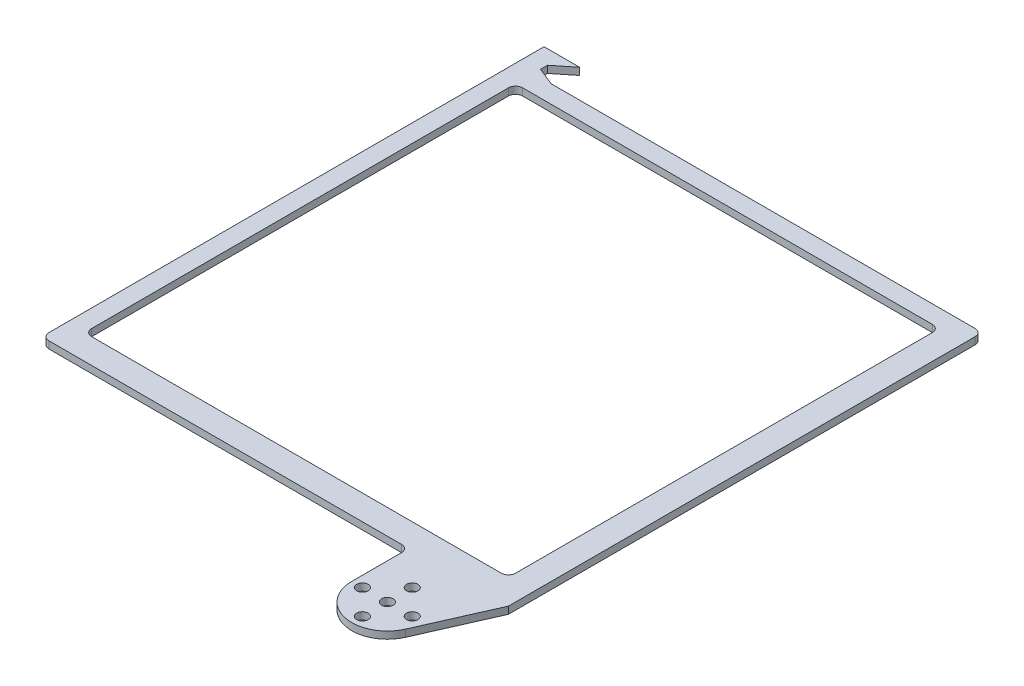
ISO-10303-21;
HEADER;
FILE_DESCRIPTION(('STEP AP214'),'2;1');
FILE_NAME('part.step','',(''),(''),'','','');
FILE_SCHEMA(('AUTOMOTIVE_DESIGN { 1 0 10303 214 1 1 1 1 }'));
ENDSEC;
DATA;
#1=APPLICATION_CONTEXT('core data for automotive mechanical design processes');
#2=APPLICATION_PROTOCOL_DEFINITION('international standard','automotive_design',2000,#1);
#3=PRODUCT_CONTEXT('',#1,'mechanical');
#4=PRODUCT('Part','Part','',(#3));
#5=PRODUCT_RELATED_PRODUCT_CATEGORY('part','',(#4));
#6=PRODUCT_DEFINITION_FORMATION('','',#4);
#7=PRODUCT_DEFINITION_CONTEXT('part definition',#1,'design');
#8=PRODUCT_DEFINITION('design','',#6,#7);
#9=PRODUCT_DEFINITION_SHAPE('','',#8);
#10=(LENGTH_UNIT() NAMED_UNIT(*) SI_UNIT(.MILLI.,.METRE.));
#11=(NAMED_UNIT(*) PLANE_ANGLE_UNIT() SI_UNIT($,.RADIAN.));
#12=(NAMED_UNIT(*) SI_UNIT($,.STERADIAN.) SOLID_ANGLE_UNIT());
#13=UNCERTAINTY_MEASURE_WITH_UNIT(LENGTH_MEASURE(1.E-05),#10,'distance_accuracy_value','');
#14=(GEOMETRIC_REPRESENTATION_CONTEXT(3) GLOBAL_UNCERTAINTY_ASSIGNED_CONTEXT((#13)) GLOBAL_UNIT_ASSIGNED_CONTEXT((#10,
#11,#12)) REPRESENTATION_CONTEXT('',''));
#15=CARTESIAN_POINT('',(0.,0.,0.));
#16=DIRECTION('',(0.,0.,1.));
#17=DIRECTION('',(1.,0.,0.));
#18=AXIS2_PLACEMENT_3D('',#15,#16,#17);
#19=CARTESIAN_POINT('',(-18.,2.,16.));
#20=DIRECTION('',(0.,1.,0.));
#21=DIRECTION('',(0.,0.,1.));
#22=AXIS2_PLACEMENT_3D('',#19,#20,#21);
#23=PLANE('',#22);
#24=CARTESIAN_POINT('',(-124.,2.,-8.99999999999998));
#25=DIRECTION('',(0.,1.,0.));
#26=DIRECTION('',(0.,0.,1.));
#27=AXIS2_PLACEMENT_3D('',#24,#25,#26);
#28=CIRCLE('',#27,1.99999999999999);
#29=CARTESIAN_POINT('',(-126.,2.,-8.99999999999998));
#30=VERTEX_POINT('',#29);
#31=CARTESIAN_POINT('',(-124.,2.,-6.99999999999999));
#32=VERTEX_POINT('',#31);
#33=EDGE_CURVE('E192',#30,#32,#28,.T.);
#34=ORIENTED_EDGE('',*,*,#33,.F.);
#35=DIRECTION('',(0.,0.,1.));
#36=VECTOR('',#35,1.);
#37=CARTESIAN_POINT('',(-126.,2.,-126.));
#38=LINE('',#37,#36);
#39=CARTESIAN_POINT('',(-126.,2.,-126.));
#40=VERTEX_POINT('',#39);
#41=EDGE_CURVE('E211',#40,#30,#38,.T.);
#42=ORIENTED_EDGE('',*,*,#41,.F.);
#43=CARTESIAN_POINT('',(-124.,2.,-126.));
#44=DIRECTION('',(0.,1.,0.));
#45=DIRECTION('',(0.,0.,1.));
#46=AXIS2_PLACEMENT_3D('',#43,#44,#45);
#47=CIRCLE('',#46,2.);
#48=CARTESIAN_POINT('',(-124.,2.,-128.));
#49=VERTEX_POINT('',#48);
#50=EDGE_CURVE('E214',#49,#40,#47,.T.);
#51=ORIENTED_EDGE('',*,*,#50,.F.);
#52=DIRECTION('',(-1.,0.,0.));
#53=VECTOR('',#52,1.);
#54=CARTESIAN_POINT('',(-124.,2.,-128.));
#55=LINE('',#54,#53);
#56=CARTESIAN_POINT('',(-9.00000000000001,2.,-128.));
#57=VERTEX_POINT('',#56);
#58=EDGE_CURVE('E242',#57,#49,#55,.T.);
#59=ORIENTED_EDGE('',*,*,#58,.F.);
#60=CARTESIAN_POINT('',(-9.00000000000001,2.,-126.));
#61=DIRECTION('',(0.,1.,0.));
#62=DIRECTION('',(0.,0.,-1.));
#63=AXIS2_PLACEMENT_3D('',#60,#61,#62);
#64=CIRCLE('',#63,2.00000000000001);
#65=CARTESIAN_POINT('',(-7.,2.,-126.));
#66=VERTEX_POINT('',#65);
#67=EDGE_CURVE('E239',#66,#57,#64,.T.);
#68=ORIENTED_EDGE('',*,*,#67,.F.);
#69=DIRECTION('',(0.,0.,-1.));
#70=VECTOR('',#69,1.);
#71=CARTESIAN_POINT('',(-7.,2.,-126.));
#72=LINE('',#71,#70);
#73=CARTESIAN_POINT('',(-6.99999999999999,2.,-8.99999999999998));
#74=VERTEX_POINT('',#73);
#75=EDGE_CURVE('E236',#74,#66,#72,.T.);
#76=ORIENTED_EDGE('',*,*,#75,.F.);
#77=CARTESIAN_POINT('',(-8.99999999999998,2.,-8.99999999999998));
#78=DIRECTION('',(0.,1.,0.));
#79=DIRECTION('',(0.,0.,1.));
#80=AXIS2_PLACEMENT_3D('',#77,#78,#79);
#81=CIRCLE('',#80,2.);
#82=CARTESIAN_POINT('',(-8.99999999999998,2.,-6.99999999999999));
#83=VERTEX_POINT('',#82);
#84=EDGE_CURVE('E233',#83,#74,#81,.T.);
#85=ORIENTED_EDGE('',*,*,#84,.F.);
#86=DIRECTION('',(1.,0.,0.));
#87=VECTOR('',#86,1.);
#88=CARTESIAN_POINT('',(-124.,2.,-6.99999999999998));
#89=LINE('',#88,#87);
#90=EDGE_CURVE('E231',#32,#83,#89,.T.);
#91=ORIENTED_EDGE('',*,*,#90,.F.);
#92=EDGE_LOOP('',(#34,#42,#51,#59,#68,#76,#85,#91));
#93=FACE_BOUND('',#92,.T.);
#94=CARTESIAN_POINT('',(-18.,2.,23.));
#95=DIRECTION('',(0.,1.,0.));
#96=DIRECTION('',(0.,0.,1.));
#97=AXIS2_PLACEMENT_3D('',#94,#95,#96);
#98=CIRCLE('',#97,1.6);
#99=CARTESIAN_POINT('',(-18.,2.,24.6));
#100=VERTEX_POINT('',#99);
#101=EDGE_CURVE('E300',#100,#100,#98,.T.);
#102=ORIENTED_EDGE('',*,*,#101,.F.);
#103=EDGE_LOOP('',(#102));
#104=FACE_BOUND('',#103,.T.);
#105=CARTESIAN_POINT('',(-18.,2.,16.));
#106=DIRECTION('',(0.,1.,0.));
#107=DIRECTION('',(0.,0.,1.));
#108=AXIS2_PLACEMENT_3D('',#105,#106,#107);
#109=CIRCLE('',#108,1.6);
#110=CARTESIAN_POINT('',(-18.,2.,17.6));
#111=VERTEX_POINT('',#110);
#112=EDGE_CURVE('E312',#111,#111,#109,.T.);
#113=ORIENTED_EDGE('',*,*,#112,.F.);
#114=EDGE_LOOP('',(#113));
#115=FACE_BOUND('',#114,.T.);
#116=DIRECTION('',(0.,0.,1.));
#117=VECTOR('',#116,1.);
#118=CARTESIAN_POINT('',(-131.,2.,0.));
#119=LINE('',#118,#117);
#120=CARTESIAN_POINT('',(-131.,2.,-141.));
#121=VERTEX_POINT('',#120);
#122=CARTESIAN_POINT('',(-131.,2.,-1.99999999999998));
#123=VERTEX_POINT('',#122);
#124=EDGE_CURVE('E332',#121,#123,#119,.T.);
#125=ORIENTED_EDGE('',*,*,#124,.T.);
#126=CARTESIAN_POINT('',(-129.,2.,-1.99999999999998));
#127=DIRECTION('',(0.,1.,0.));
#128=DIRECTION('',(0.,0.,1.));
#129=AXIS2_PLACEMENT_3D('',#126,#127,#128);
#130=CIRCLE('',#129,2.);
#131=CARTESIAN_POINT('',(-129.,2.,0.));
#132=VERTEX_POINT('',#131);
#133=EDGE_CURVE('E381',#123,#132,#130,.T.);
#134=ORIENTED_EDGE('',*,*,#133,.T.);
#135=DIRECTION('',(1.,0.,0.));
#136=VECTOR('',#135,1.);
#137=CARTESIAN_POINT('',(-28.,2.,0.));
#138=LINE('',#137,#136);
#139=CARTESIAN_POINT('',(-30.,2.,0.));
#140=VERTEX_POINT('',#139);
#141=EDGE_CURVE('E335',#132,#140,#138,.T.);
#142=ORIENTED_EDGE('',*,*,#141,.T.);
#143=CARTESIAN_POINT('',(-30.,2.,2.));
#144=DIRECTION('',(0.,1.,0.));
#145=DIRECTION('',(0.,0.,1.));
#146=AXIS2_PLACEMENT_3D('',#143,#144,#145);
#147=CIRCLE('',#146,2.);
#148=CARTESIAN_POINT('',(-28.,2.,2.));
#149=VERTEX_POINT('',#148);
#150=EDGE_CURVE('E11',#140,#149,#147,.F.);
#151=ORIENTED_EDGE('',*,*,#150,.T.);
#152=DIRECTION('',(0.,0.,1.));
#153=VECTOR('',#152,1.);
#154=CARTESIAN_POINT('',(-28.,2.,16.));
#155=LINE('',#154,#153);
#156=CARTESIAN_POINT('',(-28.,2.,16.));
#157=VERTEX_POINT('',#156);
#158=EDGE_CURVE('E338',#149,#157,#155,.T.);
#159=ORIENTED_EDGE('',*,*,#158,.T.);
#160=CARTESIAN_POINT('',(-18.,2.,16.));
#161=DIRECTION('',(0.,1.,0.));
#162=DIRECTION('',(0.,0.,1.));
#163=AXIS2_PLACEMENT_3D('',#160,#161,#162);
#164=CIRCLE('',#163,10.);
#165=CARTESIAN_POINT('',(-8.85271660683954,2.,20.0406938173055));
#166=VERTEX_POINT('',#165);
#167=EDGE_CURVE('E340',#157,#166,#164,.T.);
#168=ORIENTED_EDGE('',*,*,#167,.T.);
#169=DIRECTION('',(0.404069381730551,0.,-0.914728339316045));
#170=VECTOR('',#169,1.);
#171=CARTESIAN_POINT('',(0.,2.,0.));
#172=LINE('',#171,#170);
#173=CARTESIAN_POINT('',(0.,2.,0.));
#174=VERTEX_POINT('',#173);
#175=EDGE_CURVE('E324',#166,#174,#172,.T.);
#176=ORIENTED_EDGE('',*,*,#175,.T.);
#177=DIRECTION('',(0.,0.,-1.));
#178=VECTOR('',#177,1.);
#179=CARTESIAN_POINT('',(0.,2.,0.));
#180=LINE('',#179,#178);
#181=CARTESIAN_POINT('',(0.,2.,-131.));
#182=VERTEX_POINT('',#181);
#183=EDGE_CURVE('E327',#174,#182,#180,.T.);
#184=ORIENTED_EDGE('',*,*,#183,.T.);
#185=CARTESIAN_POINT('',(-2.,2.,-131.));
#186=DIRECTION('',(0.,1.,0.));
#187=DIRECTION('',(0.,0.,1.));
#188=AXIS2_PLACEMENT_3D('',#185,#186,#187);
#189=CIRCLE('',#188,2.);
#190=CARTESIAN_POINT('',(-2.,2.,-133.));
#191=VERTEX_POINT('',#190);
#192=EDGE_CURVE('E51',#182,#191,#189,.T.);
#193=ORIENTED_EDGE('',*,*,#192,.T.);
#194=DIRECTION('',(-1.,0.,0.));
#195=VECTOR('',#194,1.);
#196=CARTESIAN_POINT('',(0.,2.,-133.));
#197=LINE('',#196,#195);
#198=CARTESIAN_POINT('',(-121.,2.,-133.));
#199=VERTEX_POINT('',#198);
#200=EDGE_CURVE('E330',#191,#199,#197,.T.);
#201=ORIENTED_EDGE('',*,*,#200,.T.);
#202=DIRECTION('',(-0.92847669088526,0.,-0.371390676354103));
#203=VECTOR('',#202,1.);
#204=CARTESIAN_POINT('',(-126.,2.,-135.));
#205=LINE('',#204,#203);
#206=CARTESIAN_POINT('',(-126.,2.,-135.));
#207=VERTEX_POINT('',#206);
#208=EDGE_CURVE('E249',#199,#207,#205,.T.);
#209=ORIENTED_EDGE('',*,*,#208,.T.);
#210=DIRECTION('',(0.,0.,-1.));
#211=VECTOR('',#210,1.);
#212=CARTESIAN_POINT('',(-126.,2.,-137.));
#213=LINE('',#212,#211);
#214=CARTESIAN_POINT('',(-126.,2.,-137.));
#215=VERTEX_POINT('',#214);
#216=EDGE_CURVE('E271',#207,#215,#213,.T.);
#217=ORIENTED_EDGE('',*,*,#216,.T.);
#218=DIRECTION('',(0.780868809443033,0.,-0.624695047554421));
#219=VECTOR('',#218,1.);
#220=CARTESIAN_POINT('',(-121.,2.,-141.));
#221=LINE('',#220,#219);
#222=CARTESIAN_POINT('',(-121.,2.,-141.));
#223=VERTEX_POINT('',#222);
#224=EDGE_CURVE('E274',#215,#223,#221,.T.);
#225=ORIENTED_EDGE('',*,*,#224,.T.);
#226=DIRECTION('',(-1.,0.,0.));
#227=VECTOR('',#226,1.);
#228=CARTESIAN_POINT('',(-131.,2.,-141.));
#229=LINE('',#228,#227);
#230=EDGE_CURVE('E277',#223,#121,#229,.T.);
#231=ORIENTED_EDGE('',*,*,#230,.T.);
#232=EDGE_LOOP('',(#125,#134,#142,#151,#159,#168,#176,#184,#193,#201,#209,#217,#225,#231));
#233=FACE_BOUND('',#232,.T.);
#234=CARTESIAN_POINT('',(-18.,2.,9.));
#235=DIRECTION('',(0.,1.,0.));
#236=DIRECTION('',(0.,0.,1.));
#237=AXIS2_PLACEMENT_3D('',#234,#235,#236);
#238=CIRCLE('',#237,1.6);
#239=CARTESIAN_POINT('',(-18.,2.,10.6));
#240=VERTEX_POINT('',#239);
#241=EDGE_CURVE('E318',#240,#240,#238,.T.);
#242=ORIENTED_EDGE('',*,*,#241,.F.);
#243=EDGE_LOOP('',(#242));
#244=FACE_BOUND('',#243,.T.);
#245=CARTESIAN_POINT('',(-11.,2.,16.));
#246=DIRECTION('',(0.,1.,0.));
#247=DIRECTION('',(0.,0.,1.));
#248=AXIS2_PLACEMENT_3D('',#245,#246,#247);
#249=CIRCLE('',#248,1.6);
#250=CARTESIAN_POINT('',(-11.,2.,17.6));
#251=VERTEX_POINT('',#250);
#252=EDGE_CURVE('E306',#251,#251,#249,.T.);
#253=ORIENTED_EDGE('',*,*,#252,.F.);
#254=EDGE_LOOP('',(#253));
#255=FACE_BOUND('',#254,.T.);
#256=CARTESIAN_POINT('',(-25.,2.,16.));
#257=DIRECTION('',(0.,1.,0.));
#258=DIRECTION('',(0.,0.,1.));
#259=AXIS2_PLACEMENT_3D('',#256,#257,#258);
#260=CIRCLE('',#259,1.6);
#261=CARTESIAN_POINT('',(-25.,2.,17.6));
#262=VERTEX_POINT('',#261);
#263=EDGE_CURVE('E294',#262,#262,#260,.T.);
#264=ORIENTED_EDGE('',*,*,#263,.F.);
#265=EDGE_LOOP('',(#264));
#266=FACE_BOUND('',#265,.T.);
#267=ADVANCED_FACE('F36',(#93,#104,#115,#233,#244,#255,#266),#23,.T.);
#268=CARTESIAN_POINT('',(-18.,0.,16.));
#269=DIRECTION('',(0.,1.,0.));
#270=DIRECTION('',(0.,0.,1.));
#271=AXIS2_PLACEMENT_3D('',#268,#269,#270);
#272=PLANE('',#271);
#273=DIRECTION('',(0.,0.,1.));
#274=VECTOR('',#273,1.);
#275=CARTESIAN_POINT('',(-126.,0.,-126.));
#276=LINE('',#275,#274);
#277=CARTESIAN_POINT('',(-126.,0.,-126.));
#278=VERTEX_POINT('',#277);
#279=CARTESIAN_POINT('',(-126.,0.,-8.99999999999998));
#280=VERTEX_POINT('',#279);
#281=EDGE_CURVE('E197',#278,#280,#276,.T.);
#282=ORIENTED_EDGE('',*,*,#281,.T.);
#283=CARTESIAN_POINT('',(-124.,0.,-8.99999999999998));
#284=DIRECTION('',(0.,1.,0.));
#285=DIRECTION('',(0.,0.,1.));
#286=AXIS2_PLACEMENT_3D('',#283,#284,#285);
#287=CIRCLE('',#286,1.99999999999999);
#288=CARTESIAN_POINT('',(-124.,0.,-6.99999999999998));
#289=VERTEX_POINT('',#288);
#290=EDGE_CURVE('E189',#280,#289,#287,.T.);
#291=ORIENTED_EDGE('',*,*,#290,.T.);
#292=DIRECTION('',(1.,0.,0.));
#293=VECTOR('',#292,1.);
#294=CARTESIAN_POINT('',(-124.,0.,-6.99999999999998));
#295=LINE('',#294,#293);
#296=CARTESIAN_POINT('',(-8.99999999999998,0.,-6.99999999999999));
#297=VERTEX_POINT('',#296);
#298=EDGE_CURVE('E201',#289,#297,#295,.T.);
#299=ORIENTED_EDGE('',*,*,#298,.T.);
#300=CARTESIAN_POINT('',(-8.99999999999998,0.,-8.99999999999998));
#301=DIRECTION('',(0.,1.,0.));
#302=DIRECTION('',(0.,0.,1.));
#303=AXIS2_PLACEMENT_3D('',#300,#301,#302);
#304=CIRCLE('',#303,2.);
#305=CARTESIAN_POINT('',(-6.99999999999999,0.,-8.99999999999998));
#306=VERTEX_POINT('',#305);
#307=EDGE_CURVE('E205',#297,#306,#304,.T.);
#308=ORIENTED_EDGE('',*,*,#307,.T.);
#309=DIRECTION('',(0.,0.,-1.));
#310=VECTOR('',#309,1.);
#311=CARTESIAN_POINT('',(-7.,0.,-126.));
#312=LINE('',#311,#310);
#313=CARTESIAN_POINT('',(-7.,0.,-126.));
#314=VERTEX_POINT('',#313);
#315=EDGE_CURVE('E218',#306,#314,#312,.T.);
#316=ORIENTED_EDGE('',*,*,#315,.T.);
#317=CARTESIAN_POINT('',(-9.00000000000001,0.,-126.));
#318=DIRECTION('',(0.,1.,0.));
#319=DIRECTION('',(0.,0.,-1.));
#320=AXIS2_PLACEMENT_3D('',#317,#318,#319);
#321=CIRCLE('',#320,2.00000000000001);
#322=CARTESIAN_POINT('',(-9.00000000000001,0.,-128.));
#323=VERTEX_POINT('',#322);
#324=EDGE_CURVE('E221',#314,#323,#321,.T.);
#325=ORIENTED_EDGE('',*,*,#324,.T.);
#326=DIRECTION('',(-1.,0.,0.));
#327=VECTOR('',#326,1.);
#328=CARTESIAN_POINT('',(-124.,0.,-128.));
#329=LINE('',#328,#327);
#330=CARTESIAN_POINT('',(-124.,0.,-128.));
#331=VERTEX_POINT('',#330);
#332=EDGE_CURVE('E224',#323,#331,#329,.T.);
#333=ORIENTED_EDGE('',*,*,#332,.T.);
#334=CARTESIAN_POINT('',(-124.,0.,-126.));
#335=DIRECTION('',(0.,1.,0.));
#336=DIRECTION('',(0.,0.,1.));
#337=AXIS2_PLACEMENT_3D('',#334,#335,#336);
#338=CIRCLE('',#337,2.);
#339=EDGE_CURVE('E227',#331,#278,#338,.T.);
#340=ORIENTED_EDGE('',*,*,#339,.T.);
#341=EDGE_LOOP('',(#282,#291,#299,#308,#316,#325,#333,#340));
#342=FACE_BOUND('',#341,.T.);
#343=DIRECTION('',(1.,0.,0.));
#344=VECTOR('',#343,1.);
#345=CARTESIAN_POINT('',(-28.,0.,0.));
#346=LINE('',#345,#344);
#347=CARTESIAN_POINT('',(-129.,0.,0.));
#348=VERTEX_POINT('',#347);
#349=CARTESIAN_POINT('',(-30.,0.,0.));
#350=VERTEX_POINT('',#349);
#351=EDGE_CURVE('E352',#348,#350,#346,.T.);
#352=ORIENTED_EDGE('',*,*,#351,.F.);
#353=CARTESIAN_POINT('',(-129.,0.,-1.99999999999998));
#354=DIRECTION('',(0.,1.,0.));
#355=DIRECTION('',(0.,0.,1.));
#356=AXIS2_PLACEMENT_3D('',#353,#354,#355);
#357=CIRCLE('',#356,2.);
#358=CARTESIAN_POINT('',(-131.,0.,-1.99999999999998));
#359=VERTEX_POINT('',#358);
#360=EDGE_CURVE('E376',#348,#359,#357,.F.);
#361=ORIENTED_EDGE('',*,*,#360,.T.);
#362=DIRECTION('',(0.,0.,1.));
#363=VECTOR('',#362,1.);
#364=CARTESIAN_POINT('',(-131.,0.,0.));
#365=LINE('',#364,#363);
#366=CARTESIAN_POINT('',(-131.,0.,-141.));
#367=VERTEX_POINT('',#366);
#368=EDGE_CURVE('E349',#367,#359,#365,.T.);
#369=ORIENTED_EDGE('',*,*,#368,.F.);
#370=DIRECTION('',(1.,0.,0.));
#371=VECTOR('',#370,1.);
#372=CARTESIAN_POINT('',(-131.,0.,-141.));
#373=LINE('',#372,#371);
#374=CARTESIAN_POINT('',(-121.,0.,-141.));
#375=VERTEX_POINT('',#374);
#376=EDGE_CURVE('E266',#367,#375,#373,.T.);
#377=ORIENTED_EDGE('',*,*,#376,.T.);
#378=DIRECTION('',(-0.780868809443033,0.,0.624695047554421));
#379=VECTOR('',#378,1.);
#380=CARTESIAN_POINT('',(-121.,0.,-141.));
#381=LINE('',#380,#379);
#382=CARTESIAN_POINT('',(-126.,0.,-137.));
#383=VERTEX_POINT('',#382);
#384=EDGE_CURVE('E263',#375,#383,#381,.T.);
#385=ORIENTED_EDGE('',*,*,#384,.T.);
#386=DIRECTION('',(0.,0.,1.));
#387=VECTOR('',#386,1.);
#388=CARTESIAN_POINT('',(-126.,0.,-137.));
#389=LINE('',#388,#387);
#390=CARTESIAN_POINT('',(-126.,0.,-135.));
#391=VERTEX_POINT('',#390);
#392=EDGE_CURVE('E261',#383,#391,#389,.T.);
#393=ORIENTED_EDGE('',*,*,#392,.T.);
#394=DIRECTION('',(0.92847669088526,0.,0.371390676354103));
#395=VECTOR('',#394,1.);
#396=CARTESIAN_POINT('',(-126.,0.,-135.));
#397=LINE('',#396,#395);
#398=CARTESIAN_POINT('',(-121.,0.,-133.));
#399=VERTEX_POINT('',#398);
#400=EDGE_CURVE('E268',#391,#399,#397,.T.);
#401=ORIENTED_EDGE('',*,*,#400,.T.);
#402=DIRECTION('',(-1.,0.,0.));
#403=VECTOR('',#402,1.);
#404=CARTESIAN_POINT('',(0.,0.,-133.));
#405=LINE('',#404,#403);
#406=CARTESIAN_POINT('',(-2.,0.,-133.));
#407=VERTEX_POINT('',#406);
#408=EDGE_CURVE('E347',#407,#399,#405,.T.);
#409=ORIENTED_EDGE('',*,*,#408,.F.);
#410=CARTESIAN_POINT('',(-2.,0.,-131.));
#411=DIRECTION('',(0.,1.,0.));
#412=DIRECTION('',(0.,0.,1.));
#413=AXIS2_PLACEMENT_3D('',#410,#411,#412);
#414=CIRCLE('',#413,2.);
#415=CARTESIAN_POINT('',(0.,0.,-131.));
#416=VERTEX_POINT('',#415);
#417=EDGE_CURVE('E374',#407,#416,#414,.F.);
#418=ORIENTED_EDGE('',*,*,#417,.T.);
#419=DIRECTION('',(0.,0.,-1.));
#420=VECTOR('',#419,1.);
#421=CARTESIAN_POINT('',(0.,0.,0.));
#422=LINE('',#421,#420);
#423=CARTESIAN_POINT('',(0.,0.,0.));
#424=VERTEX_POINT('',#423);
#425=EDGE_CURVE('E345',#424,#416,#422,.T.);
#426=ORIENTED_EDGE('',*,*,#425,.F.);
#427=DIRECTION('',(0.404069381730551,0.,-0.914728339316045));
#428=VECTOR('',#427,1.);
#429=CARTESIAN_POINT('',(0.,0.,0.));
#430=LINE('',#429,#428);
#431=CARTESIAN_POINT('',(-8.85271660683954,0.,20.0406938173055));
#432=VERTEX_POINT('',#431);
#433=EDGE_CURVE('E321',#432,#424,#430,.T.);
#434=ORIENTED_EDGE('',*,*,#433,.F.);
#435=CARTESIAN_POINT('',(-18.,0.,16.));
#436=DIRECTION('',(0.,1.,0.));
#437=DIRECTION('',(0.,0.,1.));
#438=AXIS2_PLACEMENT_3D('',#435,#436,#437);
#439=CIRCLE('',#438,10.);
#440=CARTESIAN_POINT('',(-28.,0.,16.));
#441=VERTEX_POINT('',#440);
#442=EDGE_CURVE('E328',#441,#432,#439,.T.);
#443=ORIENTED_EDGE('',*,*,#442,.F.);
#444=DIRECTION('',(0.,0.,1.));
#445=VECTOR('',#444,1.);
#446=CARTESIAN_POINT('',(-28.,0.,16.));
#447=LINE('',#446,#445);
#448=CARTESIAN_POINT('',(-28.,0.,2.));
#449=VERTEX_POINT('',#448);
#450=EDGE_CURVE('E355',#449,#441,#447,.T.);
#451=ORIENTED_EDGE('',*,*,#450,.F.);
#452=CARTESIAN_POINT('',(-30.,0.,2.));
#453=DIRECTION('',(0.,1.,0.));
#454=DIRECTION('',(0.,0.,1.));
#455=AXIS2_PLACEMENT_3D('',#452,#453,#454);
#456=CIRCLE('',#455,2.);
#457=EDGE_CURVE('E44',#449,#350,#456,.T.);
#458=ORIENTED_EDGE('',*,*,#457,.T.);
#459=EDGE_LOOP('',(#352,#361,#369,#377,#385,#393,#401,#409,#418,#426,#434,#443,#451,#458));
#460=FACE_BOUND('',#459,.T.);
#461=CARTESIAN_POINT('',(-18.,0.,9.));
#462=DIRECTION('',(0.,1.,0.));
#463=DIRECTION('',(0.,0.,1.));
#464=AXIS2_PLACEMENT_3D('',#461,#462,#463);
#465=CIRCLE('',#464,1.6);
#466=CARTESIAN_POINT('',(-18.,0.,10.6));
#467=VERTEX_POINT('',#466);
#468=EDGE_CURVE('E315',#467,#467,#465,.T.);
#469=ORIENTED_EDGE('',*,*,#468,.T.);
#470=EDGE_LOOP('',(#469));
#471=FACE_BOUND('',#470,.T.);
#472=CARTESIAN_POINT('',(-18.,0.,16.));
#473=DIRECTION('',(0.,1.,0.));
#474=DIRECTION('',(0.,0.,1.));
#475=AXIS2_PLACEMENT_3D('',#472,#473,#474);
#476=CIRCLE('',#475,1.6);
#477=CARTESIAN_POINT('',(-18.,0.,17.6));
#478=VERTEX_POINT('',#477);
#479=EDGE_CURVE('E309',#478,#478,#476,.T.);
#480=ORIENTED_EDGE('',*,*,#479,.T.);
#481=EDGE_LOOP('',(#480));
#482=FACE_BOUND('',#481,.T.);
#483=CARTESIAN_POINT('',(-11.,0.,16.));
#484=DIRECTION('',(0.,1.,0.));
#485=DIRECTION('',(0.,0.,1.));
#486=AXIS2_PLACEMENT_3D('',#483,#484,#485);
#487=CIRCLE('',#486,1.6);
#488=CARTESIAN_POINT('',(-11.,0.,17.6));
#489=VERTEX_POINT('',#488);
#490=EDGE_CURVE('E303',#489,#489,#487,.T.);
#491=ORIENTED_EDGE('',*,*,#490,.T.);
#492=EDGE_LOOP('',(#491));
#493=FACE_BOUND('',#492,.T.);
#494=CARTESIAN_POINT('',(-18.,0.,23.));
#495=DIRECTION('',(0.,1.,0.));
#496=DIRECTION('',(0.,0.,1.));
#497=AXIS2_PLACEMENT_3D('',#494,#495,#496);
#498=CIRCLE('',#497,1.6);
#499=CARTESIAN_POINT('',(-18.,0.,24.6));
#500=VERTEX_POINT('',#499);
#501=EDGE_CURVE('E297',#500,#500,#498,.T.);
#502=ORIENTED_EDGE('',*,*,#501,.T.);
#503=EDGE_LOOP('',(#502));
#504=FACE_BOUND('',#503,.T.);
#505=CARTESIAN_POINT('',(-25.,0.,16.));
#506=DIRECTION('',(0.,1.,0.));
#507=DIRECTION('',(0.,0.,1.));
#508=AXIS2_PLACEMENT_3D('',#505,#506,#507);
#509=CIRCLE('',#508,1.6);
#510=CARTESIAN_POINT('',(-25.,0.,17.6));
#511=VERTEX_POINT('',#510);
#512=EDGE_CURVE('E293',#511,#511,#509,.T.);
#513=ORIENTED_EDGE('',*,*,#512,.T.);
#514=EDGE_LOOP('',(#513));
#515=FACE_BOUND('',#514,.T.);
#516=ADVANCED_FACE('F207',(#342,#460,#471,#482,#493,#504,#515),#272,.F.);
#517=CARTESIAN_POINT('',(0.,2.,0.));
#518=DIRECTION('',(-0.914728339316045,0.,-0.404069381730551));
#519=DIRECTION('',(-0.404069381730551,0.,0.914728339316045));
#520=AXIS2_PLACEMENT_3D('',#517,#518,#519);
#521=PLANE('',#520);
#522=ORIENTED_EDGE('',*,*,#433,.T.);
#523=DIRECTION('',(0.,-1.,0.));
#524=VECTOR('',#523,1.);
#525=CARTESIAN_POINT('',(0.,2.,0.));
#526=LINE('',#525,#524);
#527=EDGE_CURVE('E363',#174,#424,#526,.T.);
#528=ORIENTED_EDGE('',*,*,#527,.F.);
#529=ORIENTED_EDGE('',*,*,#175,.F.);
#530=DIRECTION('',(0.,-1.,0.));
#531=VECTOR('',#530,1.);
#532=CARTESIAN_POINT('',(-8.85271660683954,2.,20.0406938173055));
#533=LINE('',#532,#531);
#534=EDGE_CURVE('E342',#166,#432,#533,.T.);
#535=ORIENTED_EDGE('',*,*,#534,.T.);
#536=EDGE_LOOP('',(#522,#528,#529,#535));
#537=FACE_BOUND('',#536,.T.);
#538=ADVANCED_FACE('F411',(#537),#521,.F.);
#539=CARTESIAN_POINT('',(0.,2.,0.));
#540=DIRECTION('',(-1.,0.,0.));
#541=DIRECTION('',(0.,0.,1.));
#542=AXIS2_PLACEMENT_3D('',#539,#540,#541);
#543=PLANE('',#542);
#544=ORIENTED_EDGE('',*,*,#425,.T.);
#545=DIRECTION('',(0.,-1.,0.));
#546=VECTOR('',#545,1.);
#547=CARTESIAN_POINT('',(0.,2.,-131.));
#548=LINE('',#547,#546);
#549=EDGE_CURVE('E59',#416,#182,#548,.F.);
#550=ORIENTED_EDGE('',*,*,#549,.T.);
#551=ORIENTED_EDGE('',*,*,#183,.F.);
#552=ORIENTED_EDGE('',*,*,#527,.T.);
#553=EDGE_LOOP('',(#544,#550,#551,#552));
#554=FACE_BOUND('',#553,.T.);
#555=ADVANCED_FACE('F413',(#554),#543,.F.);
#556=CARTESIAN_POINT('',(0.,2.,-133.));
#557=DIRECTION('',(0.,0.,1.));
#558=DIRECTION('',(1.,0.,0.));
#559=AXIS2_PLACEMENT_3D('',#556,#557,#558);
#560=PLANE('',#559);
#561=ORIENTED_EDGE('',*,*,#200,.F.);
#562=DIRECTION('',(0.,-1.,0.));
#563=VECTOR('',#562,1.);
#564=CARTESIAN_POINT('',(-2.,2.,-133.));
#565=LINE('',#564,#563);
#566=EDGE_CURVE('E383',#191,#407,#565,.T.);
#567=ORIENTED_EDGE('',*,*,#566,.T.);
#568=ORIENTED_EDGE('',*,*,#408,.T.);
#569=DIRECTION('',(0.,1.,0.));
#570=VECTOR('',#569,1.);
#571=CARTESIAN_POINT('',(-121.,-12.8062484748657,-133.));
#572=LINE('',#571,#570);
#573=EDGE_CURVE('E280',#399,#199,#572,.T.);
#574=ORIENTED_EDGE('',*,*,#573,.T.);
#575=EDGE_LOOP('',(#561,#567,#568,#574));
#576=FACE_BOUND('',#575,.T.);
#577=ADVANCED_FACE('F418',(#576),#560,.F.);
#578=CARTESIAN_POINT('',(-131.,2.,0.));
#579=DIRECTION('',(1.,0.,0.));
#580=DIRECTION('',(0.,0.,-1.));
#581=AXIS2_PLACEMENT_3D('',#578,#579,#580);
#582=PLANE('',#581);
#583=ORIENTED_EDGE('',*,*,#368,.T.);
#584=DIRECTION('',(0.,-1.,0.));
#585=VECTOR('',#584,1.);
#586=CARTESIAN_POINT('',(-131.,2.,-1.99999999999998));
#587=LINE('',#586,#585);
#588=EDGE_CURVE('E378',#359,#123,#587,.F.);
#589=ORIENTED_EDGE('',*,*,#588,.T.);
#590=ORIENTED_EDGE('',*,*,#124,.F.);
#591=DIRECTION('',(0.,1.,0.));
#592=VECTOR('',#591,1.);
#593=CARTESIAN_POINT('',(-131.,-12.8062484748657,-141.));
#594=LINE('',#593,#592);
#595=EDGE_CURVE('E264',#367,#121,#594,.T.);
#596=ORIENTED_EDGE('',*,*,#595,.F.);
#597=EDGE_LOOP('',(#583,#589,#590,#596));
#598=FACE_BOUND('',#597,.T.);
#599=ADVANCED_FACE('F445',(#598),#582,.F.);
#600=CARTESIAN_POINT('',(-28.,2.,0.));
#601=DIRECTION('',(0.,0.,-1.));
#602=DIRECTION('',(-1.,0.,0.));
#603=AXIS2_PLACEMENT_3D('',#600,#601,#602);
#604=PLANE('',#603);
#605=ORIENTED_EDGE('',*,*,#351,.T.);
#606=DIRECTION('',(0.,-1.,0.));
#607=VECTOR('',#606,1.);
#608=CARTESIAN_POINT('',(-30.,2.,0.));
#609=LINE('',#608,#607);
#610=EDGE_CURVE('E372',#350,#140,#609,.F.);
#611=ORIENTED_EDGE('',*,*,#610,.T.);
#612=ORIENTED_EDGE('',*,*,#141,.F.);
#613=DIRECTION('',(0.,-1.,0.));
#614=VECTOR('',#613,1.);
#615=CARTESIAN_POINT('',(-129.,2.,0.));
#616=LINE('',#615,#614);
#617=EDGE_CURVE('E369',#132,#348,#616,.T.);
#618=ORIENTED_EDGE('',*,*,#617,.T.);
#619=EDGE_LOOP('',(#605,#611,#612,#618));
#620=FACE_BOUND('',#619,.T.);
#621=ADVANCED_FACE('F394',(#620),#604,.F.);
#622=CARTESIAN_POINT('',(-28.,2.,16.));
#623=DIRECTION('',(1.,0.,0.));
#624=DIRECTION('',(0.,0.,-1.));
#625=AXIS2_PLACEMENT_3D('',#622,#623,#624);
#626=PLANE('',#625);
#627=ORIENTED_EDGE('',*,*,#158,.F.);
#628=DIRECTION('',(0.,-1.,0.));
#629=VECTOR('',#628,1.);
#630=CARTESIAN_POINT('',(-28.,0.,2.));
#631=LINE('',#630,#629);
#632=EDGE_CURVE('E366',#149,#449,#631,.T.);
#633=ORIENTED_EDGE('',*,*,#632,.T.);
#634=ORIENTED_EDGE('',*,*,#450,.T.);
#635=DIRECTION('',(0.,-1.,0.));
#636=VECTOR('',#635,1.);
#637=CARTESIAN_POINT('',(-28.,2.,16.));
#638=LINE('',#637,#636);
#639=EDGE_CURVE('E360',#157,#441,#638,.T.);
#640=ORIENTED_EDGE('',*,*,#639,.F.);
#641=EDGE_LOOP('',(#627,#633,#634,#640));
#642=FACE_BOUND('',#641,.T.);
#643=ADVANCED_FACE('F403',(#642),#626,.F.);
#644=CARTESIAN_POINT('',(-18.,2.,16.));
#645=DIRECTION('',(0.,-1.,0.));
#646=DIRECTION('',(0.,0.,-1.));
#647=AXIS2_PLACEMENT_3D('',#644,#645,#646);
#648=CYLINDRICAL_SURFACE('',#647,10.);
#649=ORIENTED_EDGE('',*,*,#442,.T.);
#650=ORIENTED_EDGE('',*,*,#534,.F.);
#651=ORIENTED_EDGE('',*,*,#167,.F.);
#652=ORIENTED_EDGE('',*,*,#639,.T.);
#653=EDGE_LOOP('',(#649,#650,#651,#652));
#654=FACE_BOUND('',#653,.T.);
#655=ADVANCED_FACE('F407',(#654),#648,.T.);
#656=CARTESIAN_POINT('',(-18.,2.,9.));
#657=DIRECTION('',(0.,-1.,0.));
#658=DIRECTION('',(0.,0.,-1.));
#659=AXIS2_PLACEMENT_3D('',#656,#657,#658);
#660=CYLINDRICAL_SURFACE('',#659,1.6);
#661=ORIENTED_EDGE('',*,*,#241,.T.);
#662=EDGE_LOOP('',(#661));
#663=FACE_BOUND('',#662,.T.);
#664=ORIENTED_EDGE('',*,*,#468,.F.);
#665=EDGE_LOOP('',(#664));
#666=FACE_BOUND('',#665,.T.);
#667=ADVANCED_FACE('F463',(#663,#666),#660,.F.);
#668=CARTESIAN_POINT('',(-18.,2.,16.));
#669=DIRECTION('',(0.,-1.,0.));
#670=DIRECTION('',(0.,0.,-1.));
#671=AXIS2_PLACEMENT_3D('',#668,#669,#670);
#672=CYLINDRICAL_SURFACE('',#671,1.6);
#673=ORIENTED_EDGE('',*,*,#112,.T.);
#674=EDGE_LOOP('',(#673));
#675=FACE_BOUND('',#674,.T.);
#676=ORIENTED_EDGE('',*,*,#479,.F.);
#677=EDGE_LOOP('',(#676));
#678=FACE_BOUND('',#677,.T.);
#679=ADVANCED_FACE('F485',(#675,#678),#672,.F.);
#680=CARTESIAN_POINT('',(-11.,2.,16.));
#681=DIRECTION('',(0.,-1.,0.));
#682=DIRECTION('',(0.,0.,-1.));
#683=AXIS2_PLACEMENT_3D('',#680,#681,#682);
#684=CYLINDRICAL_SURFACE('',#683,1.6);
#685=ORIENTED_EDGE('',*,*,#252,.T.);
#686=EDGE_LOOP('',(#685));
#687=FACE_BOUND('',#686,.T.);
#688=ORIENTED_EDGE('',*,*,#490,.F.);
#689=EDGE_LOOP('',(#688));
#690=FACE_BOUND('',#689,.T.);
#691=ADVANCED_FACE('F492',(#687,#690),#684,.F.);
#692=CARTESIAN_POINT('',(-18.,2.,23.));
#693=DIRECTION('',(0.,-1.,0.));
#694=DIRECTION('',(0.,0.,-1.));
#695=AXIS2_PLACEMENT_3D('',#692,#693,#694);
#696=CYLINDRICAL_SURFACE('',#695,1.6);
#697=ORIENTED_EDGE('',*,*,#101,.T.);
#698=EDGE_LOOP('',(#697));
#699=FACE_BOUND('',#698,.T.);
#700=ORIENTED_EDGE('',*,*,#501,.F.);
#701=EDGE_LOOP('',(#700));
#702=FACE_BOUND('',#701,.T.);
#703=ADVANCED_FACE('F499',(#699,#702),#696,.F.);
#704=CARTESIAN_POINT('',(-25.,2.,16.));
#705=DIRECTION('',(0.,-1.,0.));
#706=DIRECTION('',(0.,0.,-1.));
#707=AXIS2_PLACEMENT_3D('',#704,#705,#706);
#708=CYLINDRICAL_SURFACE('',#707,1.6);
#709=ORIENTED_EDGE('',*,*,#263,.T.);
#710=EDGE_LOOP('',(#709));
#711=FACE_BOUND('',#710,.T.);
#712=ORIENTED_EDGE('',*,*,#512,.F.);
#713=EDGE_LOOP('',(#712));
#714=FACE_BOUND('',#713,.T.);
#715=ADVANCED_FACE('F507',(#711,#714),#708,.F.);
#716=CARTESIAN_POINT('',(-131.,-12.8062484748657,-141.));
#717=DIRECTION('',(0.,0.,-1.));
#718=DIRECTION('',(-1.,0.,0.));
#719=AXIS2_PLACEMENT_3D('',#716,#717,#718);
#720=PLANE('',#719);
#721=ORIENTED_EDGE('',*,*,#376,.F.);
#722=ORIENTED_EDGE('',*,*,#595,.T.);
#723=ORIENTED_EDGE('',*,*,#230,.F.);
#724=DIRECTION('',(0.,1.,0.));
#725=VECTOR('',#724,1.);
#726=CARTESIAN_POINT('',(-121.,-12.8062484748657,-141.));
#727=LINE('',#726,#725);
#728=EDGE_CURVE('E283',#375,#223,#727,.T.);
#729=ORIENTED_EDGE('',*,*,#728,.F.);
#730=EDGE_LOOP('',(#721,#722,#723,#729));
#731=FACE_BOUND('',#730,.T.);
#732=ADVANCED_FACE('F438',(#731),#720,.T.);
#733=CARTESIAN_POINT('',(-121.,-12.8062484748657,-141.));
#734=DIRECTION('',(0.624695047554421,0.,0.780868809443033));
#735=DIRECTION('',(0.780868809443033,0.,-0.624695047554421));
#736=AXIS2_PLACEMENT_3D('',#733,#734,#735);
#737=PLANE('',#736);
#738=ORIENTED_EDGE('',*,*,#384,.F.);
#739=ORIENTED_EDGE('',*,*,#728,.T.);
#740=ORIENTED_EDGE('',*,*,#224,.F.);
#741=DIRECTION('',(0.,1.,0.));
#742=VECTOR('',#741,1.);
#743=CARTESIAN_POINT('',(-126.,-12.8062484748657,-137.));
#744=LINE('',#743,#742);
#745=EDGE_CURVE('E285',#383,#215,#744,.T.);
#746=ORIENTED_EDGE('',*,*,#745,.F.);
#747=EDGE_LOOP('',(#738,#739,#740,#746));
#748=FACE_BOUND('',#747,.T.);
#749=ADVANCED_FACE('F433',(#748),#737,.T.);
#750=CARTESIAN_POINT('',(-126.,-12.8062484748657,-137.));
#751=DIRECTION('',(1.,0.,0.));
#752=DIRECTION('',(0.,0.,-1.));
#753=AXIS2_PLACEMENT_3D('',#750,#751,#752);
#754=PLANE('',#753);
#755=ORIENTED_EDGE('',*,*,#392,.F.);
#756=ORIENTED_EDGE('',*,*,#745,.T.);
#757=ORIENTED_EDGE('',*,*,#216,.F.);
#758=DIRECTION('',(0.,1.,0.));
#759=VECTOR('',#758,1.);
#760=CARTESIAN_POINT('',(-126.,-12.8062484748657,-135.));
#761=LINE('',#760,#759);
#762=EDGE_CURVE('E287',#391,#207,#761,.T.);
#763=ORIENTED_EDGE('',*,*,#762,.F.);
#764=EDGE_LOOP('',(#755,#756,#757,#763));
#765=FACE_BOUND('',#764,.T.);
#766=ADVANCED_FACE('F429',(#765),#754,.T.);
#767=CARTESIAN_POINT('',(-126.,-12.8062484748657,-135.));
#768=DIRECTION('',(0.371390676354103,0.,-0.92847669088526));
#769=DIRECTION('',(-0.92847669088526,0.,-0.371390676354103));
#770=AXIS2_PLACEMENT_3D('',#767,#768,#769);
#771=PLANE('',#770);
#772=ORIENTED_EDGE('',*,*,#400,.F.);
#773=ORIENTED_EDGE('',*,*,#762,.T.);
#774=ORIENTED_EDGE('',*,*,#208,.F.);
#775=ORIENTED_EDGE('',*,*,#573,.F.);
#776=EDGE_LOOP('',(#772,#773,#774,#775));
#777=FACE_BOUND('',#776,.T.);
#778=ADVANCED_FACE('F425',(#777),#771,.T.);
#779=CARTESIAN_POINT('',(-124.,0.,-8.99999999999998));
#780=DIRECTION('',(0.,1.,0.));
#781=DIRECTION('',(0.,0.,1.));
#782=AXIS2_PLACEMENT_3D('',#779,#780,#781);
#783=CYLINDRICAL_SURFACE('',#782,1.99999999999999);
#784=ORIENTED_EDGE('',*,*,#33,.T.);
#785=DIRECTION('',(0.,1.,0.));
#786=VECTOR('',#785,1.);
#787=CARTESIAN_POINT('',(-124.,0.,-6.99999999999998));
#788=LINE('',#787,#786);
#789=EDGE_CURVE('E185',#289,#32,#788,.T.);
#790=ORIENTED_EDGE('',*,*,#789,.F.);
#791=ORIENTED_EDGE('',*,*,#290,.F.);
#792=DIRECTION('',(0.,1.,0.));
#793=VECTOR('',#792,1.);
#794=CARTESIAN_POINT('',(-126.,0.,-8.99999999999998));
#795=LINE('',#794,#793);
#796=EDGE_CURVE('E247',#280,#30,#795,.T.);
#797=ORIENTED_EDGE('',*,*,#796,.T.);
#798=EDGE_LOOP('',(#784,#790,#791,#797));
#799=FACE_BOUND('',#798,.T.);
#800=ADVANCED_FACE('F187',(#799),#783,.F.);
#801=CARTESIAN_POINT('',(-126.,0.,-126.));
#802=DIRECTION('',(-1.,0.,0.));
#803=DIRECTION('',(0.,0.,1.));
#804=AXIS2_PLACEMENT_3D('',#801,#802,#803);
#805=PLANE('',#804);
#806=ORIENTED_EDGE('',*,*,#41,.T.);
#807=ORIENTED_EDGE('',*,*,#796,.F.);
#808=ORIENTED_EDGE('',*,*,#281,.F.);
#809=DIRECTION('',(0.,1.,0.));
#810=VECTOR('',#809,1.);
#811=CARTESIAN_POINT('',(-126.,0.,-126.));
#812=LINE('',#811,#810);
#813=EDGE_CURVE('E250',#278,#40,#812,.T.);
#814=ORIENTED_EDGE('',*,*,#813,.T.);
#815=EDGE_LOOP('',(#806,#807,#808,#814));
#816=FACE_BOUND('',#815,.T.);
#817=ADVANCED_FACE('F546',(#816),#805,.F.);
#818=CARTESIAN_POINT('',(-124.,0.,-126.));
#819=DIRECTION('',(0.,1.,0.));
#820=DIRECTION('',(0.,0.,1.));
#821=AXIS2_PLACEMENT_3D('',#818,#819,#820);
#822=CYLINDRICAL_SURFACE('',#821,2.);
#823=ORIENTED_EDGE('',*,*,#50,.T.);
#824=ORIENTED_EDGE('',*,*,#813,.F.);
#825=ORIENTED_EDGE('',*,*,#339,.F.);
#826=DIRECTION('',(0.,1.,0.));
#827=VECTOR('',#826,1.);
#828=CARTESIAN_POINT('',(-124.,0.,-128.));
#829=LINE('',#828,#827);
#830=EDGE_CURVE('E252',#331,#49,#829,.T.);
#831=ORIENTED_EDGE('',*,*,#830,.T.);
#832=EDGE_LOOP('',(#823,#824,#825,#831));
#833=FACE_BOUND('',#832,.T.);
#834=ADVANCED_FACE('F553',(#833),#822,.F.);
#835=CARTESIAN_POINT('',(-124.,0.,-128.));
#836=DIRECTION('',(0.,0.,-1.));
#837=DIRECTION('',(-1.,0.,0.));
#838=AXIS2_PLACEMENT_3D('',#835,#836,#837);
#839=PLANE('',#838);
#840=ORIENTED_EDGE('',*,*,#58,.T.);
#841=ORIENTED_EDGE('',*,*,#830,.F.);
#842=ORIENTED_EDGE('',*,*,#332,.F.);
#843=DIRECTION('',(0.,1.,0.));
#844=VECTOR('',#843,1.);
#845=CARTESIAN_POINT('',(-9.00000000000001,0.,-128.));
#846=LINE('',#845,#844);
#847=EDGE_CURVE('E254',#323,#57,#846,.T.);
#848=ORIENTED_EDGE('',*,*,#847,.T.);
#849=EDGE_LOOP('',(#840,#841,#842,#848));
#850=FACE_BOUND('',#849,.T.);
#851=ADVANCED_FACE('F561',(#850),#839,.F.);
#852=CARTESIAN_POINT('',(-9.00000000000001,0.,-126.));
#853=DIRECTION('',(0.,1.,0.));
#854=DIRECTION('',(0.,0.,1.));
#855=AXIS2_PLACEMENT_3D('',#852,#853,#854);
#856=CYLINDRICAL_SURFACE('',#855,2.00000000000001);
#857=ORIENTED_EDGE('',*,*,#67,.T.);
#858=ORIENTED_EDGE('',*,*,#847,.F.);
#859=ORIENTED_EDGE('',*,*,#324,.F.);
#860=DIRECTION('',(0.,1.,0.));
#861=VECTOR('',#860,1.);
#862=CARTESIAN_POINT('',(-7.,0.,-126.));
#863=LINE('',#862,#861);
#864=EDGE_CURVE('E256',#314,#66,#863,.T.);
#865=ORIENTED_EDGE('',*,*,#864,.T.);
#866=EDGE_LOOP('',(#857,#858,#859,#865));
#867=FACE_BOUND('',#866,.T.);
#868=ADVANCED_FACE('F569',(#867),#856,.F.);
#869=CARTESIAN_POINT('',(-7.,0.,-126.));
#870=DIRECTION('',(1.,0.,0.));
#871=DIRECTION('',(0.,0.,-1.));
#872=AXIS2_PLACEMENT_3D('',#869,#870,#871);
#873=PLANE('',#872);
#874=ORIENTED_EDGE('',*,*,#75,.T.);
#875=ORIENTED_EDGE('',*,*,#864,.F.);
#876=ORIENTED_EDGE('',*,*,#315,.F.);
#877=DIRECTION('',(0.,1.,0.));
#878=VECTOR('',#877,1.);
#879=CARTESIAN_POINT('',(-6.99999999999999,0.,-8.99999999999998));
#880=LINE('',#879,#878);
#881=EDGE_CURVE('E258',#306,#74,#880,.T.);
#882=ORIENTED_EDGE('',*,*,#881,.T.);
#883=EDGE_LOOP('',(#874,#875,#876,#882));
#884=FACE_BOUND('',#883,.T.);
#885=ADVANCED_FACE('F577',(#884),#873,.F.);
#886=CARTESIAN_POINT('',(-8.99999999999998,0.,-8.99999999999998));
#887=DIRECTION('',(0.,1.,0.));
#888=DIRECTION('',(0.,0.,1.));
#889=AXIS2_PLACEMENT_3D('',#886,#887,#888);
#890=CYLINDRICAL_SURFACE('',#889,2.);
#891=ORIENTED_EDGE('',*,*,#84,.T.);
#892=ORIENTED_EDGE('',*,*,#881,.F.);
#893=ORIENTED_EDGE('',*,*,#307,.F.);
#894=DIRECTION('',(0.,1.,0.));
#895=VECTOR('',#894,1.);
#896=CARTESIAN_POINT('',(-8.99999999999998,0.,-6.99999999999999));
#897=LINE('',#896,#895);
#898=EDGE_CURVE('E196',#297,#83,#897,.T.);
#899=ORIENTED_EDGE('',*,*,#898,.T.);
#900=EDGE_LOOP('',(#891,#892,#893,#899));
#901=FACE_BOUND('',#900,.T.);
#902=ADVANCED_FACE('F585',(#901),#890,.F.);
#903=CARTESIAN_POINT('',(-124.,0.,-6.99999999999998));
#904=DIRECTION('',(0.,0.,1.));
#905=DIRECTION('',(1.,0.,0.));
#906=AXIS2_PLACEMENT_3D('',#903,#904,#905);
#907=PLANE('',#906);
#908=ORIENTED_EDGE('',*,*,#90,.T.);
#909=ORIENTED_EDGE('',*,*,#898,.F.);
#910=ORIENTED_EDGE('',*,*,#298,.F.);
#911=ORIENTED_EDGE('',*,*,#789,.T.);
#912=EDGE_LOOP('',(#908,#909,#910,#911));
#913=FACE_BOUND('',#912,.T.);
#914=ADVANCED_FACE('F202',(#913),#907,.F.);
#915=CARTESIAN_POINT('',(-30.,2.,2.));
#916=DIRECTION('',(0.,1.,0.));
#917=DIRECTION('',(0.,0.,1.));
#918=AXIS2_PLACEMENT_3D('',#915,#916,#917);
#919=CYLINDRICAL_SURFACE('',#918,2.);
#920=ORIENTED_EDGE('',*,*,#150,.F.);
#921=ORIENTED_EDGE('',*,*,#610,.F.);
#922=ORIENTED_EDGE('',*,*,#457,.F.);
#923=ORIENTED_EDGE('',*,*,#632,.F.);
#924=EDGE_LOOP('',(#920,#921,#922,#923));
#925=FACE_BOUND('',#924,.T.);
#926=ADVANCED_FACE('F398',(#925),#919,.F.);
#927=CARTESIAN_POINT('',(-129.,2.,-1.99999999999998));
#928=DIRECTION('',(0.,-1.,0.));
#929=DIRECTION('',(0.,0.,-1.));
#930=AXIS2_PLACEMENT_3D('',#927,#928,#929);
#931=CYLINDRICAL_SURFACE('',#930,2.);
#932=ORIENTED_EDGE('',*,*,#133,.F.);
#933=ORIENTED_EDGE('',*,*,#588,.F.);
#934=ORIENTED_EDGE('',*,*,#360,.F.);
#935=ORIENTED_EDGE('',*,*,#617,.F.);
#936=EDGE_LOOP('',(#932,#933,#934,#935));
#937=FACE_BOUND('',#936,.T.);
#938=ADVANCED_FACE('F444',(#937),#931,.T.);
#939=CARTESIAN_POINT('',(-2.,2.,-131.));
#940=DIRECTION('',(0.,-1.,0.));
#941=DIRECTION('',(0.,0.,-1.));
#942=AXIS2_PLACEMENT_3D('',#939,#940,#941);
#943=CYLINDRICAL_SURFACE('',#942,2.);
#944=ORIENTED_EDGE('',*,*,#192,.F.);
#945=ORIENTED_EDGE('',*,*,#549,.F.);
#946=ORIENTED_EDGE('',*,*,#417,.F.);
#947=ORIENTED_EDGE('',*,*,#566,.F.);
#948=EDGE_LOOP('',(#944,#945,#946,#947));
#949=FACE_BOUND('',#948,.T.);
#950=ADVANCED_FACE('F38',(#949),#943,.T.);
#951=CLOSED_SHELL('',(#267,#516,#538,#555,#577,#599,#621,#643,#655,#667,#679,#691,#703,#715,
#732,#749,#766,#778,#800,#817,#834,#851,#868,#885,#902,#914,#926,#938,#950));
#952=MANIFOLD_SOLID_BREP('B2',#951);
#953=ADVANCED_BREP_SHAPE_REPRESENTATION('',(#18,#952),#14);
#954=SHAPE_DEFINITION_REPRESENTATION(#9,#953);
ENDSEC;
END-ISO-10303-21;
